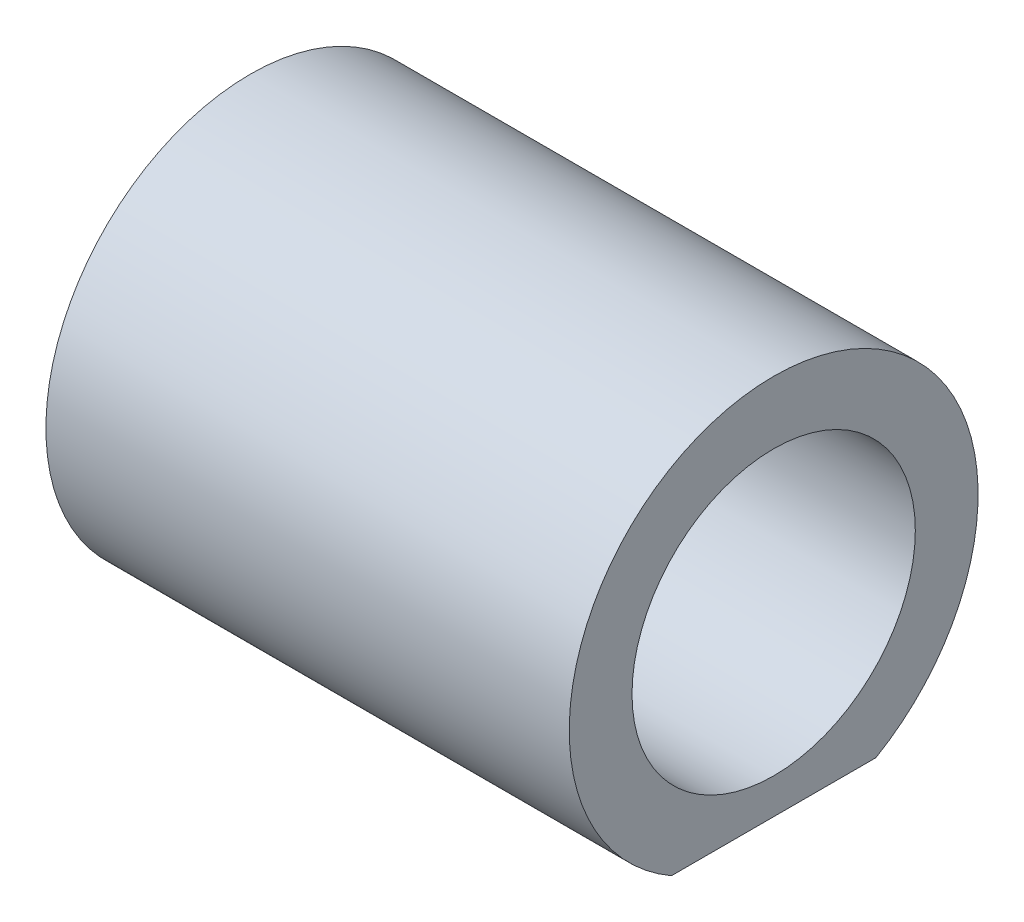
ISO-10303-21;
HEADER;
FILE_DESCRIPTION(('STEP AP214'),'2;1');
FILE_NAME('part.step','',(''),(''),'','','');
FILE_SCHEMA(('AUTOMOTIVE_DESIGN { 1 0 10303 214 1 1 1 1 }'));
ENDSEC;
DATA;
#1=APPLICATION_CONTEXT('core data for automotive mechanical design processes');
#2=APPLICATION_PROTOCOL_DEFINITION('international standard','automotive_design',2000,#1);
#3=PRODUCT_CONTEXT('',#1,'mechanical');
#4=PRODUCT('Part','Part','',(#3));
#5=PRODUCT_RELATED_PRODUCT_CATEGORY('part','',(#4));
#6=PRODUCT_DEFINITION_FORMATION('','',#4);
#7=PRODUCT_DEFINITION_CONTEXT('part definition',#1,'design');
#8=PRODUCT_DEFINITION('design','',#6,#7);
#9=PRODUCT_DEFINITION_SHAPE('','',#8);
#10=(LENGTH_UNIT() NAMED_UNIT(*) SI_UNIT(.MILLI.,.METRE.));
#11=(NAMED_UNIT(*) PLANE_ANGLE_UNIT() SI_UNIT($,.RADIAN.));
#12=(NAMED_UNIT(*) SI_UNIT($,.STERADIAN.) SOLID_ANGLE_UNIT());
#13=UNCERTAINTY_MEASURE_WITH_UNIT(LENGTH_MEASURE(1.E-05),#10,'distance_accuracy_value','');
#14=(GEOMETRIC_REPRESENTATION_CONTEXT(3) GLOBAL_UNCERTAINTY_ASSIGNED_CONTEXT((#13)) GLOBAL_UNIT_ASSIGNED_CONTEXT((#10,
#11,#12)) REPRESENTATION_CONTEXT('',''));
#15=CARTESIAN_POINT('',(0.,0.,0.));
#16=DIRECTION('',(0.,0.,1.));
#17=DIRECTION('',(1.,0.,0.));
#18=AXIS2_PLACEMENT_3D('',#15,#16,#17);
#19=CARTESIAN_POINT('',(20.32,0.,0.));
#20=DIRECTION('',(-1.,0.,0.));
#21=DIRECTION('',(0.,0.,1.));
#22=AXIS2_PLACEMENT_3D('',#19,#20,#21);
#23=PLANE('',#22);
#24=CARTESIAN_POINT('',(20.32,0.,0.));
#25=DIRECTION('',(1.,0.,0.));
#26=DIRECTION('',(0.,0.,1.));
#27=AXIS2_PLACEMENT_3D('',#24,#25,#26);
#28=CIRCLE('',#27,7.9375);
#29=CARTESIAN_POINT('',(20.32,-6.87407664253898,-3.96875));
#30=VERTEX_POINT('',#29);
#31=CARTESIAN_POINT('',(20.32,-6.87407664253898,3.96875));
#32=VERTEX_POINT('',#31);
#33=EDGE_CURVE('E72',#30,#32,#28,.T.);
#34=ORIENTED_EDGE('',*,*,#33,.T.);
#35=DIRECTION('',(0.,0.,-1.));
#36=VECTOR('',#35,1.);
#37=CARTESIAN_POINT('',(20.32,-6.87407664253898,-3.96875));
#38=LINE('',#37,#36);
#39=EDGE_CURVE('E57',#32,#30,#38,.T.);
#40=ORIENTED_EDGE('',*,*,#39,.T.);
#41=EDGE_LOOP('',(#34,#40));
#42=FACE_BOUND('',#41,.T.);
#43=CARTESIAN_POINT('',(20.32,0.,0.));
#44=DIRECTION('',(1.,0.,0.));
#45=DIRECTION('',(0.,0.,-1.));
#46=AXIS2_PLACEMENT_3D('',#43,#44,#45);
#47=CIRCLE('',#46,5.500000049);
#48=CARTESIAN_POINT('',(20.32,0.,-5.500000049));
#49=VERTEX_POINT('',#48);
#50=EDGE_CURVE('E78',#49,#49,#47,.T.);
#51=ORIENTED_EDGE('',*,*,#50,.F.);
#52=EDGE_LOOP('',(#51));
#53=FACE_BOUND('',#52,.T.);
#54=ADVANCED_FACE('F41',(#42,#53),#23,.F.);
#55=CARTESIAN_POINT('',(0.,0.,0.));
#56=DIRECTION('',(-1.,0.,0.));
#57=DIRECTION('',(0.,0.,1.));
#58=AXIS2_PLACEMENT_3D('',#55,#56,#57);
#59=PLANE('',#58);
#60=CARTESIAN_POINT('',(0.,0.,0.));
#61=DIRECTION('',(1.,0.,0.));
#62=DIRECTION('',(0.,0.,1.));
#63=AXIS2_PLACEMENT_3D('',#60,#61,#62);
#64=CIRCLE('',#63,7.9375);
#65=CARTESIAN_POINT('',(0.,-6.87407664253898,-3.96875));
#66=VERTEX_POINT('',#65);
#67=CARTESIAN_POINT('',(0.,-6.87407664253898,3.96875));
#68=VERTEX_POINT('',#67);
#69=EDGE_CURVE('E73',#66,#68,#64,.T.);
#70=ORIENTED_EDGE('',*,*,#69,.F.);
#71=DIRECTION('',(0.,0.,-1.));
#72=VECTOR('',#71,1.);
#73=CARTESIAN_POINT('',(0.,-6.87407664253898,-3.96875));
#74=LINE('',#73,#72);
#75=EDGE_CURVE('E65',#68,#66,#74,.T.);
#76=ORIENTED_EDGE('',*,*,#75,.F.);
#77=EDGE_LOOP('',(#70,#76));
#78=FACE_BOUND('',#77,.T.);
#79=CARTESIAN_POINT('',(0.,0.,0.));
#80=DIRECTION('',(1.,0.,0.));
#81=DIRECTION('',(0.,0.,-1.));
#82=AXIS2_PLACEMENT_3D('',#79,#80,#81);
#83=CIRCLE('',#82,5.500000049);
#84=CARTESIAN_POINT('',(0.,0.,-5.500000049));
#85=VERTEX_POINT('',#84);
#86=EDGE_CURVE('E81',#85,#85,#83,.T.);
#87=ORIENTED_EDGE('',*,*,#86,.T.);
#88=EDGE_LOOP('',(#87));
#89=FACE_BOUND('',#88,.T.);
#90=ADVANCED_FACE('F76',(#78,#89),#59,.T.);
#91=CARTESIAN_POINT('',(20.32,0.,0.));
#92=DIRECTION('',(-1.,0.,0.));
#93=DIRECTION('',(0.,0.,1.));
#94=AXIS2_PLACEMENT_3D('',#91,#92,#93);
#95=CYLINDRICAL_SURFACE('',#94,7.9375);
#96=ORIENTED_EDGE('',*,*,#69,.T.);
#97=DIRECTION('',(-1.,0.,0.));
#98=VECTOR('',#97,1.);
#99=CARTESIAN_POINT('',(20.32,-6.87407664253898,3.96875));
#100=LINE('',#99,#98);
#101=EDGE_CURVE('E11',#32,#68,#100,.T.);
#102=ORIENTED_EDGE('',*,*,#101,.F.);
#103=ORIENTED_EDGE('',*,*,#33,.F.);
#104=DIRECTION('',(-1.,0.,0.));
#105=VECTOR('',#104,1.);
#106=CARTESIAN_POINT('',(20.32,-6.87407664253898,-3.96875));
#107=LINE('',#106,#105);
#108=EDGE_CURVE('E50',#30,#66,#107,.T.);
#109=ORIENTED_EDGE('',*,*,#108,.T.);
#110=EDGE_LOOP('',(#96,#102,#103,#109));
#111=FACE_BOUND('',#110,.T.);
#112=ADVANCED_FACE('F43',(#111),#95,.T.);
#113=CARTESIAN_POINT('',(20.32,-6.87407664253898,-3.96875));
#114=DIRECTION('',(0.,1.,0.));
#115=DIRECTION('',(0.,0.,1.));
#116=AXIS2_PLACEMENT_3D('',#113,#114,#115);
#117=PLANE('',#116);
#118=ORIENTED_EDGE('',*,*,#75,.T.);
#119=ORIENTED_EDGE('',*,*,#108,.F.);
#120=ORIENTED_EDGE('',*,*,#39,.F.);
#121=ORIENTED_EDGE('',*,*,#101,.T.);
#122=EDGE_LOOP('',(#118,#119,#120,#121));
#123=FACE_BOUND('',#122,.T.);
#124=ADVANCED_FACE('F68',(#123),#117,.F.);
#125=CARTESIAN_POINT('',(20.32,0.,0.));
#126=DIRECTION('',(-1.,0.,0.));
#127=DIRECTION('',(0.,0.,1.));
#128=AXIS2_PLACEMENT_3D('',#125,#126,#127);
#129=CYLINDRICAL_SURFACE('',#128,5.500000049);
#130=ORIENTED_EDGE('',*,*,#50,.T.);
#131=EDGE_LOOP('',(#130));
#132=FACE_BOUND('',#131,.T.);
#133=ORIENTED_EDGE('',*,*,#86,.F.);
#134=EDGE_LOOP('',(#133));
#135=FACE_BOUND('',#134,.T.);
#136=ADVANCED_FACE('F89',(#132,#135),#129,.F.);
#137=CLOSED_SHELL('',(#54,#90,#112,#124,#136));
#138=MANIFOLD_SOLID_BREP('B2',#137);
#139=ADVANCED_BREP_SHAPE_REPRESENTATION('',(#18,#138),#14);
#140=SHAPE_DEFINITION_REPRESENTATION(#9,#139);
ENDSEC;
END-ISO-10303-21;
